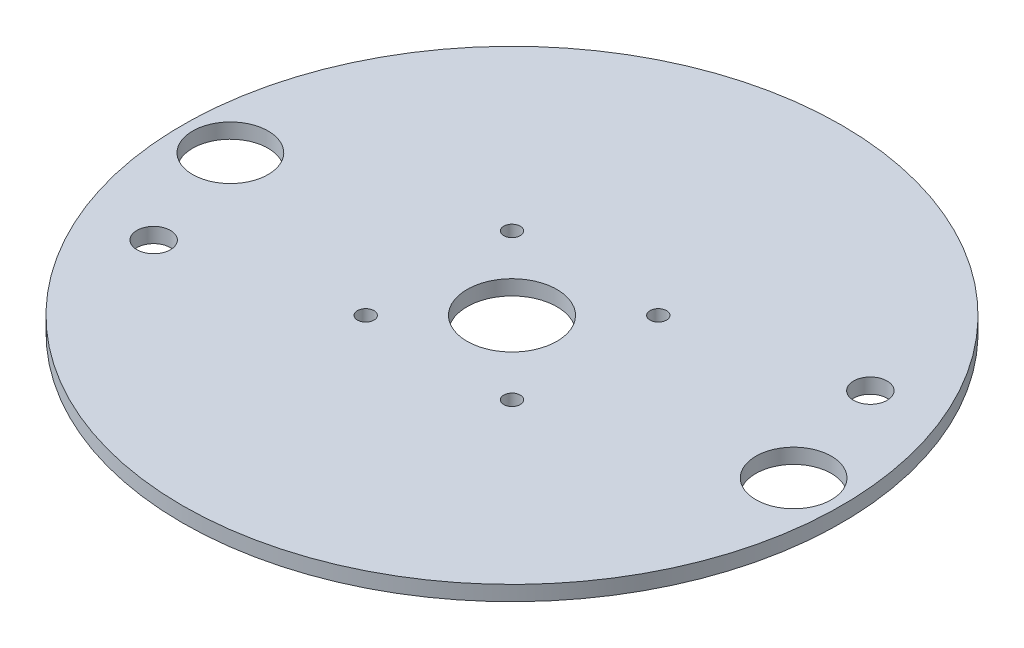
ISO-10303-21;
HEADER;
FILE_DESCRIPTION(('STEP AP214'),'2;1');
FILE_NAME('part.step','',(''),(''),'','','');
FILE_SCHEMA(('AUTOMOTIVE_DESIGN { 1 0 10303 214 1 1 1 1 }'));
ENDSEC;
DATA;
#1=APPLICATION_CONTEXT('core data for automotive mechanical design processes');
#2=APPLICATION_PROTOCOL_DEFINITION('international standard','automotive_design',2000,#1);
#3=PRODUCT_CONTEXT('',#1,'mechanical');
#4=PRODUCT('Part','Part','',(#3));
#5=PRODUCT_RELATED_PRODUCT_CATEGORY('part','',(#4));
#6=PRODUCT_DEFINITION_FORMATION('','',#4);
#7=PRODUCT_DEFINITION_CONTEXT('part definition',#1,'design');
#8=PRODUCT_DEFINITION('design','',#6,#7);
#9=PRODUCT_DEFINITION_SHAPE('','',#8);
#10=(LENGTH_UNIT() NAMED_UNIT(*) SI_UNIT(.MILLI.,.METRE.));
#11=(NAMED_UNIT(*) PLANE_ANGLE_UNIT() SI_UNIT($,.RADIAN.));
#12=(NAMED_UNIT(*) SI_UNIT($,.STERADIAN.) SOLID_ANGLE_UNIT());
#13=UNCERTAINTY_MEASURE_WITH_UNIT(LENGTH_MEASURE(1.E-05),#10,'distance_accuracy_value','');
#14=(GEOMETRIC_REPRESENTATION_CONTEXT(3) GLOBAL_UNCERTAINTY_ASSIGNED_CONTEXT((#13)) GLOBAL_UNIT_ASSIGNED_CONTEXT((#10,
#11,#12)) REPRESENTATION_CONTEXT('',''));
#15=CARTESIAN_POINT('',(0.,0.,0.));
#16=DIRECTION('',(0.,0.,1.));
#17=DIRECTION('',(1.,0.,0.));
#18=AXIS2_PLACEMENT_3D('',#15,#16,#17);
#19=CARTESIAN_POINT('',(0.,3.175,0.));
#20=DIRECTION('',(0.,1.,0.));
#21=DIRECTION('',(0.,0.,1.));
#22=AXIS2_PLACEMENT_3D('',#19,#20,#21);
#23=PLANE('',#22);
#24=CARTESIAN_POINT('',(-15.5,3.175,-15.5));
#25=DIRECTION('',(0.,1.,0.));
#26=DIRECTION('',(0.,0.,1.));
#27=AXIS2_PLACEMENT_3D('',#24,#25,#26);
#28=CIRCLE('',#27,1.75);
#29=CARTESIAN_POINT('',(-15.5,3.175,-13.75));
#30=VERTEX_POINT('',#29);
#31=EDGE_CURVE('E116',#30,#30,#28,.T.);
#32=ORIENTED_EDGE('',*,*,#31,.F.);
#33=EDGE_LOOP('',(#32));
#34=FACE_BOUND('',#33,.T.);
#35=CARTESIAN_POINT('',(-15.5,3.175,15.5));
#36=DIRECTION('',(0.,1.,0.));
#37=DIRECTION('',(0.,0.,1.));
#38=AXIS2_PLACEMENT_3D('',#35,#36,#37);
#39=CIRCLE('',#38,1.750000056);
#40=CARTESIAN_POINT('',(-15.5,3.175,17.250000056));
#41=VERTEX_POINT('',#40);
#42=EDGE_CURVE('E120',#41,#41,#39,.T.);
#43=ORIENTED_EDGE('',*,*,#42,.F.);
#44=EDGE_LOOP('',(#43));
#45=FACE_BOUND('',#44,.T.);
#46=CARTESIAN_POINT('',(15.5,3.175,15.5));
#47=DIRECTION('',(0.,1.,0.));
#48=DIRECTION('',(0.,0.,1.));
#49=AXIS2_PLACEMENT_3D('',#46,#47,#48);
#50=CIRCLE('',#49,1.750000056);
#51=CARTESIAN_POINT('',(15.5,3.175,17.250000056));
#52=VERTEX_POINT('',#51);
#53=EDGE_CURVE('E124',#52,#52,#50,.T.);
#54=ORIENTED_EDGE('',*,*,#53,.F.);
#55=EDGE_LOOP('',(#54));
#56=FACE_BOUND('',#55,.T.);
#57=CARTESIAN_POINT('',(15.5,3.175,-15.5));
#58=DIRECTION('',(0.,1.,0.));
#59=DIRECTION('',(0.,0.,1.));
#60=AXIS2_PLACEMENT_3D('',#57,#58,#59);
#61=CIRCLE('',#60,1.750000056);
#62=CARTESIAN_POINT('',(15.5,3.175,-13.749999944));
#63=VERTEX_POINT('',#62);
#64=EDGE_CURVE('E60',#63,#63,#61,.T.);
#65=ORIENTED_EDGE('',*,*,#64,.F.);
#66=EDGE_LOOP('',(#65));
#67=FACE_BOUND('',#66,.T.);
#68=CARTESIAN_POINT('',(51.7954900291446,3.175,-24.152633658481));
#69=DIRECTION('',(0.,1.,0.));
#70=DIRECTION('',(0.,0.,1.));
#71=AXIS2_PLACEMENT_3D('',#68,#69,#70);
#72=CIRCLE('',#71,3.556);
#73=CARTESIAN_POINT('',(51.7954900291446,3.175,-20.596633658481));
#74=VERTEX_POINT('',#73);
#75=EDGE_CURVE('E71',#74,#74,#72,.T.);
#76=ORIENTED_EDGE('',*,*,#75,.F.);
#77=EDGE_LOOP('',(#76));
#78=FACE_BOUND('',#77,.T.);
#79=CARTESIAN_POINT('',(-51.7954900291446,3.175,24.1526336584811));
#80=DIRECTION('',(0.,1.,0.));
#81=DIRECTION('',(0.,0.,1.));
#82=AXIS2_PLACEMENT_3D('',#79,#80,#81);
#83=CIRCLE('',#82,3.556);
#84=CARTESIAN_POINT('',(-51.7954900291446,3.175,27.7086336584811));
#85=VERTEX_POINT('',#84);
#86=EDGE_CURVE('E133',#85,#85,#83,.T.);
#87=ORIENTED_EDGE('',*,*,#86,.F.);
#88=EDGE_LOOP('',(#87));
#89=FACE_BOUND('',#88,.T.);
#90=CARTESIAN_POINT('',(59.69,3.175,0.));
#91=DIRECTION('',(0.,1.,0.));
#92=DIRECTION('',(0.,0.,1.));
#93=AXIS2_PLACEMENT_3D('',#90,#91,#92);
#94=CIRCLE('',#93,8.00099999999998);
#95=CARTESIAN_POINT('',(59.69,3.175,8.00099999999996));
#96=VERTEX_POINT('',#95);
#97=EDGE_CURVE('E85',#96,#96,#94,.T.);
#98=ORIENTED_EDGE('',*,*,#97,.F.);
#99=EDGE_LOOP('',(#98));
#100=FACE_BOUND('',#99,.T.);
#101=CARTESIAN_POINT('',(-59.69,3.175,0.));
#102=DIRECTION('',(0.,1.,0.));
#103=DIRECTION('',(0.,0.,1.));
#104=AXIS2_PLACEMENT_3D('',#101,#102,#103);
#105=CIRCLE('',#104,8.001);
#106=CARTESIAN_POINT('',(-59.69,3.175,8.00100000000002));
#107=VERTEX_POINT('',#106);
#108=EDGE_CURVE('E83',#107,#107,#105,.T.);
#109=ORIENTED_EDGE('',*,*,#108,.F.);
#110=EDGE_LOOP('',(#109));
#111=FACE_BOUND('',#110,.T.);
#112=CARTESIAN_POINT('',(0.,3.175,0.));
#113=DIRECTION('',(0.,1.,0.));
#114=DIRECTION('',(0.,0.,1.));
#115=AXIS2_PLACEMENT_3D('',#112,#113,#114);
#116=CIRCLE('',#115,69.85);
#117=CARTESIAN_POINT('',(0.,3.175,69.85));
#118=VERTEX_POINT('',#117);
#119=EDGE_CURVE('E10',#118,#118,#116,.T.);
#120=ORIENTED_EDGE('',*,*,#119,.T.);
#121=EDGE_LOOP('',(#120));
#122=FACE_BOUND('',#121,.T.);
#123=CARTESIAN_POINT('',(0.,3.175,0.));
#124=DIRECTION('',(0.,1.,0.));
#125=DIRECTION('',(0.,0.,1.));
#126=AXIS2_PLACEMENT_3D('',#123,#124,#125);
#127=CIRCLE('',#126,9.525);
#128=CARTESIAN_POINT('',(0.,3.175,9.525));
#129=VERTEX_POINT('',#128);
#130=EDGE_CURVE('E50',#129,#129,#127,.T.);
#131=ORIENTED_EDGE('',*,*,#130,.F.);
#132=EDGE_LOOP('',(#131));
#133=FACE_BOUND('',#132,.T.);
#134=ADVANCED_FACE('F37',(#34,#45,#56,#67,#78,#89,#100,#111,#122,#133),#23,.T.);
#135=CARTESIAN_POINT('',(0.,0.,0.));
#136=DIRECTION('',(0.,1.,0.));
#137=DIRECTION('',(0.,0.,1.));
#138=AXIS2_PLACEMENT_3D('',#135,#136,#137);
#139=PLANE('',#138);
#140=CARTESIAN_POINT('',(-15.5,0.,-15.5));
#141=DIRECTION('',(0.,1.,0.));
#142=DIRECTION('',(0.,0.,1.));
#143=AXIS2_PLACEMENT_3D('',#140,#141,#142);
#144=CIRCLE('',#143,1.75);
#145=CARTESIAN_POINT('',(-15.5,0.,-13.75));
#146=VERTEX_POINT('',#145);
#147=EDGE_CURVE('E41',#146,#146,#144,.T.);
#148=ORIENTED_EDGE('',*,*,#147,.T.);
#149=EDGE_LOOP('',(#148));
#150=FACE_BOUND('',#149,.T.);
#151=CARTESIAN_POINT('',(-15.5,0.,15.5));
#152=DIRECTION('',(0.,1.,0.));
#153=DIRECTION('',(0.,0.,1.));
#154=AXIS2_PLACEMENT_3D('',#151,#152,#153);
#155=CIRCLE('',#154,1.750000056);
#156=CARTESIAN_POINT('',(-15.5,0.,17.250000056));
#157=VERTEX_POINT('',#156);
#158=EDGE_CURVE('E62',#157,#157,#155,.T.);
#159=ORIENTED_EDGE('',*,*,#158,.T.);
#160=EDGE_LOOP('',(#159));
#161=FACE_BOUND('',#160,.T.);
#162=CARTESIAN_POINT('',(15.5,0.,15.5));
#163=DIRECTION('',(0.,1.,0.));
#164=DIRECTION('',(0.,0.,1.));
#165=AXIS2_PLACEMENT_3D('',#162,#163,#164);
#166=CIRCLE('',#165,1.750000056);
#167=CARTESIAN_POINT('',(15.5,0.,17.250000056));
#168=VERTEX_POINT('',#167);
#169=EDGE_CURVE('E59',#168,#168,#166,.T.);
#170=ORIENTED_EDGE('',*,*,#169,.T.);
#171=EDGE_LOOP('',(#170));
#172=FACE_BOUND('',#171,.T.);
#173=CARTESIAN_POINT('',(15.5,0.,-15.5));
#174=DIRECTION('',(0.,1.,0.));
#175=DIRECTION('',(0.,0.,1.));
#176=AXIS2_PLACEMENT_3D('',#173,#174,#175);
#177=CIRCLE('',#176,1.750000056);
#178=CARTESIAN_POINT('',(15.5,0.,-13.749999944));
#179=VERTEX_POINT('',#178);
#180=EDGE_CURVE('E56',#179,#179,#177,.T.);
#181=ORIENTED_EDGE('',*,*,#180,.T.);
#182=EDGE_LOOP('',(#181));
#183=FACE_BOUND('',#182,.T.);
#184=CARTESIAN_POINT('',(51.7954900291446,0.,-24.152633658481));
#185=DIRECTION('',(0.,1.,0.));
#186=DIRECTION('',(0.,0.,1.));
#187=AXIS2_PLACEMENT_3D('',#184,#185,#186);
#188=CIRCLE('',#187,3.556);
#189=CARTESIAN_POINT('',(51.7954900291446,0.,-20.596633658481));
#190=VERTEX_POINT('',#189);
#191=EDGE_CURVE('E67',#190,#190,#188,.T.);
#192=ORIENTED_EDGE('',*,*,#191,.T.);
#193=EDGE_LOOP('',(#192));
#194=FACE_BOUND('',#193,.T.);
#195=CARTESIAN_POINT('',(-51.7954900291446,0.,24.1526336584811));
#196=DIRECTION('',(0.,1.,0.));
#197=DIRECTION('',(0.,0.,1.));
#198=AXIS2_PLACEMENT_3D('',#195,#196,#197);
#199=CIRCLE('',#198,3.556);
#200=CARTESIAN_POINT('',(-51.7954900291446,0.,27.7086336584811));
#201=VERTEX_POINT('',#200);
#202=EDGE_CURVE('E76',#201,#201,#199,.T.);
#203=ORIENTED_EDGE('',*,*,#202,.T.);
#204=EDGE_LOOP('',(#203));
#205=FACE_BOUND('',#204,.T.);
#206=CARTESIAN_POINT('',(59.69,0.,0.));
#207=DIRECTION('',(0.,1.,0.));
#208=DIRECTION('',(0.,0.,1.));
#209=AXIS2_PLACEMENT_3D('',#206,#207,#208);
#210=CIRCLE('',#209,8.00099999999998);
#211=CARTESIAN_POINT('',(59.69,0.,8.00099999999996));
#212=VERTEX_POINT('',#211);
#213=EDGE_CURVE('E141',#212,#212,#210,.T.);
#214=ORIENTED_EDGE('',*,*,#213,.T.);
#215=EDGE_LOOP('',(#214));
#216=FACE_BOUND('',#215,.T.);
#217=CARTESIAN_POINT('',(-59.69,0.,0.));
#218=DIRECTION('',(0.,1.,0.));
#219=DIRECTION('',(0.,0.,1.));
#220=AXIS2_PLACEMENT_3D('',#217,#218,#219);
#221=CIRCLE('',#220,8.001);
#222=CARTESIAN_POINT('',(-59.69,0.,8.00100000000002));
#223=VERTEX_POINT('',#222);
#224=EDGE_CURVE('E80',#223,#223,#221,.T.);
#225=ORIENTED_EDGE('',*,*,#224,.T.);
#226=EDGE_LOOP('',(#225));
#227=FACE_BOUND('',#226,.T.);
#228=CARTESIAN_POINT('',(0.,0.,0.));
#229=DIRECTION('',(0.,1.,0.));
#230=DIRECTION('',(0.,0.,1.));
#231=AXIS2_PLACEMENT_3D('',#228,#229,#230);
#232=CIRCLE('',#231,69.85);
#233=CARTESIAN_POINT('',(0.,0.,69.85));
#234=VERTEX_POINT('',#233);
#235=EDGE_CURVE('E45',#234,#234,#232,.T.);
#236=ORIENTED_EDGE('',*,*,#235,.F.);
#237=EDGE_LOOP('',(#236));
#238=FACE_BOUND('',#237,.T.);
#239=CARTESIAN_POINT('',(0.,0.,0.));
#240=DIRECTION('',(0.,1.,0.));
#241=DIRECTION('',(0.,0.,1.));
#242=AXIS2_PLACEMENT_3D('',#239,#240,#241);
#243=CIRCLE('',#242,9.525);
#244=CARTESIAN_POINT('',(0.,0.,9.525));
#245=VERTEX_POINT('',#244);
#246=EDGE_CURVE('E53',#245,#245,#243,.T.);
#247=ORIENTED_EDGE('',*,*,#246,.T.);
#248=EDGE_LOOP('',(#247));
#249=FACE_BOUND('',#248,.T.);
#250=ADVANCED_FACE('F92',(#150,#161,#172,#183,#194,#205,#216,#227,#238,#249),#139,.F.);
#251=CARTESIAN_POINT('',(0.,3.175,0.));
#252=DIRECTION('',(0.,-1.,0.));
#253=DIRECTION('',(0.,0.,-1.));
#254=AXIS2_PLACEMENT_3D('',#251,#252,#253);
#255=CYLINDRICAL_SURFACE('',#254,69.85);
#256=ORIENTED_EDGE('',*,*,#119,.F.);
#257=EDGE_LOOP('',(#256));
#258=FACE_BOUND('',#257,.T.);
#259=ORIENTED_EDGE('',*,*,#235,.T.);
#260=EDGE_LOOP('',(#259));
#261=FACE_BOUND('',#260,.T.);
#262=ADVANCED_FACE('F39',(#258,#261),#255,.T.);
#263=CARTESIAN_POINT('',(0.,3.175,0.));
#264=DIRECTION('',(0.,-1.,0.));
#265=DIRECTION('',(0.,0.,-1.));
#266=AXIS2_PLACEMENT_3D('',#263,#264,#265);
#267=CYLINDRICAL_SURFACE('',#266,9.525);
#268=ORIENTED_EDGE('',*,*,#130,.T.);
#269=EDGE_LOOP('',(#268));
#270=FACE_BOUND('',#269,.T.);
#271=ORIENTED_EDGE('',*,*,#246,.F.);
#272=EDGE_LOOP('',(#271));
#273=FACE_BOUND('',#272,.T.);
#274=ADVANCED_FACE('F94',(#270,#273),#267,.F.);
#275=CARTESIAN_POINT('',(-59.69,0.,0.));
#276=DIRECTION('',(0.,1.,0.));
#277=DIRECTION('',(0.,0.,1.));
#278=AXIS2_PLACEMENT_3D('',#275,#276,#277);
#279=CYLINDRICAL_SURFACE('',#278,8.001);
#280=ORIENTED_EDGE('',*,*,#224,.F.);
#281=EDGE_LOOP('',(#280));
#282=FACE_BOUND('',#281,.T.);
#283=ORIENTED_EDGE('',*,*,#108,.T.);
#284=EDGE_LOOP('',(#283));
#285=FACE_BOUND('',#284,.T.);
#286=ADVANCED_FACE('F96',(#282,#285),#279,.F.);
#287=CARTESIAN_POINT('',(59.69,0.,0.));
#288=DIRECTION('',(0.,1.,0.));
#289=DIRECTION('',(0.,0.,1.));
#290=AXIS2_PLACEMENT_3D('',#287,#288,#289);
#291=CYLINDRICAL_SURFACE('',#290,8.00099999999998);
#292=ORIENTED_EDGE('',*,*,#213,.F.);
#293=EDGE_LOOP('',(#292));
#294=FACE_BOUND('',#293,.T.);
#295=ORIENTED_EDGE('',*,*,#97,.T.);
#296=EDGE_LOOP('',(#295));
#297=FACE_BOUND('',#296,.T.);
#298=ADVANCED_FACE('F102',(#294,#297),#291,.F.);
#299=CARTESIAN_POINT('',(-51.7954900291446,0.,24.1526336584811));
#300=DIRECTION('',(0.,1.,0.));
#301=DIRECTION('',(0.,0.,1.));
#302=AXIS2_PLACEMENT_3D('',#299,#300,#301);
#303=CYLINDRICAL_SURFACE('',#302,3.556);
#304=ORIENTED_EDGE('',*,*,#202,.F.);
#305=EDGE_LOOP('',(#304));
#306=FACE_BOUND('',#305,.T.);
#307=ORIENTED_EDGE('',*,*,#86,.T.);
#308=EDGE_LOOP('',(#307));
#309=FACE_BOUND('',#308,.T.);
#310=ADVANCED_FACE('F153',(#306,#309),#303,.F.);
#311=CARTESIAN_POINT('',(51.7954900291446,0.,-24.152633658481));
#312=DIRECTION('',(0.,1.,0.));
#313=DIRECTION('',(0.,0.,1.));
#314=AXIS2_PLACEMENT_3D('',#311,#312,#313);
#315=CYLINDRICAL_SURFACE('',#314,3.556);
#316=ORIENTED_EDGE('',*,*,#191,.F.);
#317=EDGE_LOOP('',(#316));
#318=FACE_BOUND('',#317,.T.);
#319=ORIENTED_EDGE('',*,*,#75,.T.);
#320=EDGE_LOOP('',(#319));
#321=FACE_BOUND('',#320,.T.);
#322=ADVANCED_FACE('F156',(#318,#321),#315,.F.);
#323=CARTESIAN_POINT('',(15.5,-47.625,-15.5));
#324=DIRECTION('',(0.,1.,0.));
#325=DIRECTION('',(0.,0.,1.));
#326=AXIS2_PLACEMENT_3D('',#323,#324,#325);
#327=CYLINDRICAL_SURFACE('',#326,1.750000056);
#328=ORIENTED_EDGE('',*,*,#64,.T.);
#329=EDGE_LOOP('',(#328));
#330=FACE_BOUND('',#329,.T.);
#331=ORIENTED_EDGE('',*,*,#180,.F.);
#332=EDGE_LOOP('',(#331));
#333=FACE_BOUND('',#332,.T.);
#334=ADVANCED_FACE('F161',(#330,#333),#327,.F.);
#335=CARTESIAN_POINT('',(15.5,-47.625,15.5));
#336=DIRECTION('',(0.,1.,0.));
#337=DIRECTION('',(0.,0.,1.));
#338=AXIS2_PLACEMENT_3D('',#335,#336,#337);
#339=CYLINDRICAL_SURFACE('',#338,1.750000056);
#340=ORIENTED_EDGE('',*,*,#53,.T.);
#341=EDGE_LOOP('',(#340));
#342=FACE_BOUND('',#341,.T.);
#343=ORIENTED_EDGE('',*,*,#169,.F.);
#344=EDGE_LOOP('',(#343));
#345=FACE_BOUND('',#344,.T.);
#346=ADVANCED_FACE('F169',(#342,#345),#339,.F.);
#347=CARTESIAN_POINT('',(-15.5,-47.625,15.5));
#348=DIRECTION('',(0.,1.,0.));
#349=DIRECTION('',(0.,0.,1.));
#350=AXIS2_PLACEMENT_3D('',#347,#348,#349);
#351=CYLINDRICAL_SURFACE('',#350,1.750000056);
#352=ORIENTED_EDGE('',*,*,#42,.T.);
#353=EDGE_LOOP('',(#352));
#354=FACE_BOUND('',#353,.T.);
#355=ORIENTED_EDGE('',*,*,#158,.F.);
#356=EDGE_LOOP('',(#355));
#357=FACE_BOUND('',#356,.T.);
#358=ADVANCED_FACE('F174',(#354,#357),#351,.F.);
#359=CARTESIAN_POINT('',(-15.5,-47.625,-15.5));
#360=DIRECTION('',(0.,1.,0.));
#361=DIRECTION('',(0.,0.,1.));
#362=AXIS2_PLACEMENT_3D('',#359,#360,#361);
#363=CYLINDRICAL_SURFACE('',#362,1.75);
#364=ORIENTED_EDGE('',*,*,#31,.T.);
#365=EDGE_LOOP('',(#364));
#366=FACE_BOUND('',#365,.T.);
#367=ORIENTED_EDGE('',*,*,#147,.F.);
#368=EDGE_LOOP('',(#367));
#369=FACE_BOUND('',#368,.T.);
#370=ADVANCED_FACE('F171',(#366,#369),#363,.F.);
#371=CLOSED_SHELL('',(#134,#250,#262,#274,#286,#298,#310,#322,#334,#346,#358,#370));
#372=MANIFOLD_SOLID_BREP('B2',#371);
#373=ADVANCED_BREP_SHAPE_REPRESENTATION('',(#18,#372),#14);
#374=SHAPE_DEFINITION_REPRESENTATION(#9,#373);
ENDSEC;
END-ISO-10303-21;
